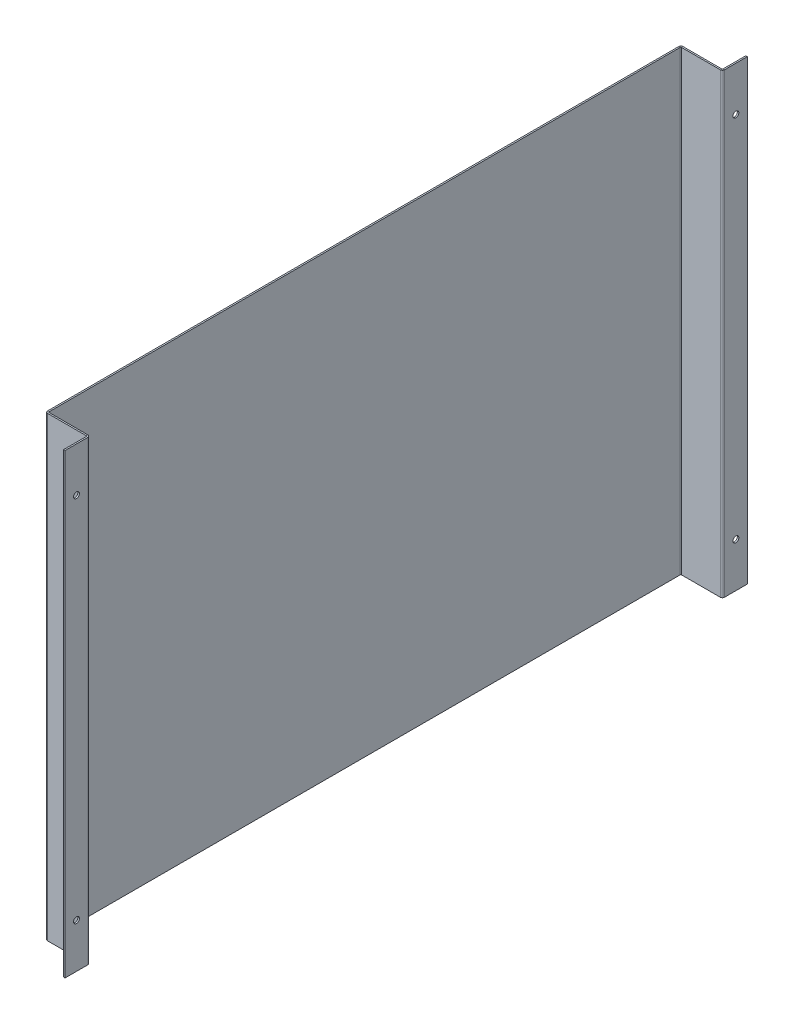
ISO-10303-21;
HEADER;
FILE_DESCRIPTION(('STEP AP214'),'2;1');
FILE_NAME('part.step','',(''),(''),'','','');
FILE_SCHEMA(('AUTOMOTIVE_DESIGN { 1 0 10303 214 1 1 1 1 }'));
ENDSEC;
DATA;
#1=APPLICATION_CONTEXT('core data for automotive mechanical design processes');
#2=APPLICATION_PROTOCOL_DEFINITION('international standard','automotive_design',2000,#1);
#3=PRODUCT_CONTEXT('',#1,'mechanical');
#4=PRODUCT('Part','Part','',(#3));
#5=PRODUCT_RELATED_PRODUCT_CATEGORY('part','',(#4));
#6=PRODUCT_DEFINITION_FORMATION('','',#4);
#7=PRODUCT_DEFINITION_CONTEXT('part definition',#1,'design');
#8=PRODUCT_DEFINITION('design','',#6,#7);
#9=PRODUCT_DEFINITION_SHAPE('','',#8);
#10=(LENGTH_UNIT() NAMED_UNIT(*) SI_UNIT(.MILLI.,.METRE.));
#11=(NAMED_UNIT(*) PLANE_ANGLE_UNIT() SI_UNIT($,.RADIAN.));
#12=(NAMED_UNIT(*) SI_UNIT($,.STERADIAN.) SOLID_ANGLE_UNIT());
#13=UNCERTAINTY_MEASURE_WITH_UNIT(LENGTH_MEASURE(1.E-05),#10,'distance_accuracy_value','');
#14=(GEOMETRIC_REPRESENTATION_CONTEXT(3) GLOBAL_UNCERTAINTY_ASSIGNED_CONTEXT((#13)) GLOBAL_UNIT_ASSIGNED_CONTEXT((#10,
#11,#12)) REPRESENTATION_CONTEXT('',''));
#15=CARTESIAN_POINT('',(0.,0.,0.));
#16=DIRECTION('',(0.,0.,1.));
#17=DIRECTION('',(1.,0.,0.));
#18=AXIS2_PLACEMENT_3D('',#15,#16,#17);
#19=CARTESIAN_POINT('',(48.2,275.,382.5));
#20=DIRECTION('',(0.,1.,0.));
#21=DIRECTION('',(0.,0.,1.));
#22=AXIS2_PLACEMENT_3D('',#19,#20,#21);
#23=PLANE('',#22);
#24=DIRECTION('',(1.,0.,0.));
#25=VECTOR('',#24,1.);
#26=CARTESIAN_POINT('',(48.2,275.,382.5));
#27=LINE('',#26,#25);
#28=CARTESIAN_POINT('',(0.736599999999967,275.,382.5));
#29=VERTEX_POINT('',#28);
#30=CARTESIAN_POINT('',(47.4634,275.,382.5));
#31=VERTEX_POINT('',#30);
#32=EDGE_CURVE('E374',#29,#31,#27,.T.);
#33=ORIENTED_EDGE('',*,*,#32,.T.);
#34=DIRECTION('',(0.,0.,-1.));
#35=VECTOR('',#34,1.);
#36=CARTESIAN_POINT('',(47.4634,275.,382.5));
#37=LINE('',#36,#35);
#38=CARTESIAN_POINT('',(47.4634,275.,380.7));
#39=VERTEX_POINT('',#38);
#40=EDGE_CURVE('E262',#31,#39,#37,.T.);
#41=ORIENTED_EDGE('',*,*,#40,.T.);
#42=DIRECTION('',(-1.,0.,0.));
#43=VECTOR('',#42,1.);
#44=CARTESIAN_POINT('',(-1.32155697174001E-12,275.,380.7));
#45=LINE('',#44,#43);
#46=CARTESIAN_POINT('',(0.736599999999974,275.,380.7));
#47=VERTEX_POINT('',#46);
#48=EDGE_CURVE('E378',#47,#39,#45,.F.);
#49=ORIENTED_EDGE('',*,*,#48,.F.);
#50=DIRECTION('',(0.,0.,1.));
#51=VECTOR('',#50,1.);
#52=CARTESIAN_POINT('',(0.736599999999976,275.,382.5));
#53=LINE('',#52,#51);
#54=EDGE_CURVE('E368',#47,#29,#53,.T.);
#55=ORIENTED_EDGE('',*,*,#54,.T.);
#56=EDGE_LOOP('',(#33,#41,#49,#55));
#57=FACE_BOUND('',#56,.T.);
#58=ADVANCED_FACE('F79',(#57),#23,.T.);
#59=CARTESIAN_POINT('',(-1.32784163814992E-12,0.,382.5));
#60=DIRECTION('',(0.,0.,1.));
#61=DIRECTION('',(1.,0.,0.));
#62=AXIS2_PLACEMENT_3D('',#59,#60,#61);
#63=PLANE('',#62);
#64=DIRECTION('',(-1.,0.,0.));
#65=VECTOR('',#64,1.);
#66=CARTESIAN_POINT('',(0.,-275.,382.5));
#67=LINE('',#66,#65);
#68=CARTESIAN_POINT('',(47.4634,-275.,382.5));
#69=VERTEX_POINT('',#68);
#70=CARTESIAN_POINT('',(0.736599999999976,-275.,382.5));
#71=VERTEX_POINT('',#70);
#72=EDGE_CURVE('E371',#69,#71,#67,.T.);
#73=ORIENTED_EDGE('',*,*,#72,.F.);
#74=DIRECTION('',(0.,1.,0.));
#75=VECTOR('',#74,1.);
#76=CARTESIAN_POINT('',(47.4634,275.,382.5));
#77=LINE('',#76,#75);
#78=EDGE_CURVE('E103',#31,#69,#77,.F.);
#79=ORIENTED_EDGE('',*,*,#78,.F.);
#80=ORIENTED_EDGE('',*,*,#32,.F.);
#81=DIRECTION('',(0.,-1.,0.));
#82=VECTOR('',#81,1.);
#83=CARTESIAN_POINT('',(0.736599999999976,0.,382.5));
#84=LINE('',#83,#82);
#85=EDGE_CURVE('E381',#29,#71,#84,.T.);
#86=ORIENTED_EDGE('',*,*,#85,.T.);
#87=EDGE_LOOP('',(#73,#79,#80,#86));
#88=FACE_BOUND('',#87,.T.);
#89=ADVANCED_FACE('F526',(#88),#63,.T.);
#90=CARTESIAN_POINT('',(-1.32155697174001E-12,0.,380.7));
#91=DIRECTION('',(0.,0.,1.));
#92=DIRECTION('',(1.,0.,0.));
#93=AXIS2_PLACEMENT_3D('',#90,#91,#92);
#94=PLANE('',#93);
#95=DIRECTION('',(0.,1.,0.));
#96=VECTOR('',#95,1.);
#97=CARTESIAN_POINT('',(47.4634,275.,380.7));
#98=LINE('',#97,#96);
#99=CARTESIAN_POINT('',(47.4634,-275.,380.7));
#100=VERTEX_POINT('',#99);
#101=EDGE_CURVE('E256',#39,#100,#98,.F.);
#102=ORIENTED_EDGE('',*,*,#101,.T.);
#103=DIRECTION('',(1.,0.,0.));
#104=VECTOR('',#103,1.);
#105=CARTESIAN_POINT('',(-1.32155697174001E-12,-275.,380.7));
#106=LINE('',#105,#104);
#107=CARTESIAN_POINT('',(0.736599999999974,-275.,380.7));
#108=VERTEX_POINT('',#107);
#109=EDGE_CURVE('E376',#100,#108,#106,.F.);
#110=ORIENTED_EDGE('',*,*,#109,.T.);
#111=DIRECTION('',(0.,1.,0.));
#112=VECTOR('',#111,1.);
#113=CARTESIAN_POINT('',(0.736599999999976,275.,380.7));
#114=LINE('',#113,#112);
#115=EDGE_CURVE('E387',#47,#108,#114,.F.);
#116=ORIENTED_EDGE('',*,*,#115,.F.);
#117=ORIENTED_EDGE('',*,*,#48,.T.);
#118=EDGE_LOOP('',(#102,#110,#116,#117));
#119=FACE_BOUND('',#118,.T.);
#120=ADVANCED_FACE('F452',(#119),#94,.F.);
#121=CARTESIAN_POINT('',(48.2,-275.,-382.5));
#122=DIRECTION('',(0.,-1.,0.));
#123=DIRECTION('',(0.,0.,-1.));
#124=AXIS2_PLACEMENT_3D('',#121,#122,#123);
#125=PLANE('',#124);
#126=DIRECTION('',(1.,0.,0.));
#127=VECTOR('',#126,1.);
#128=CARTESIAN_POINT('',(48.2,-275.,-382.5));
#129=LINE('',#128,#127);
#130=CARTESIAN_POINT('',(0.736599999999967,-275.,-382.5));
#131=VERTEX_POINT('',#130);
#132=CARTESIAN_POINT('',(47.4634,-275.,-382.5));
#133=VERTEX_POINT('',#132);
#134=EDGE_CURVE('E329',#131,#133,#129,.T.);
#135=ORIENTED_EDGE('',*,*,#134,.T.);
#136=DIRECTION('',(0.,0.,1.));
#137=VECTOR('',#136,1.);
#138=CARTESIAN_POINT('',(47.4634,-275.,-382.5));
#139=LINE('',#138,#137);
#140=CARTESIAN_POINT('',(47.4634,-275.,-380.7));
#141=VERTEX_POINT('',#140);
#142=EDGE_CURVE('E310',#133,#141,#139,.T.);
#143=ORIENTED_EDGE('',*,*,#142,.T.);
#144=DIRECTION('',(-1.,0.,0.));
#145=VECTOR('',#144,1.);
#146=CARTESIAN_POINT('',(-1.32155697174001E-12,-275.,-380.7));
#147=LINE('',#146,#145);
#148=CARTESIAN_POINT('',(0.736599999999974,-275.,-380.7));
#149=VERTEX_POINT('',#148);
#150=EDGE_CURVE('E334',#149,#141,#147,.F.);
#151=ORIENTED_EDGE('',*,*,#150,.F.);
#152=DIRECTION('',(0.,0.,-1.));
#153=VECTOR('',#152,1.);
#154=CARTESIAN_POINT('',(0.736599999999976,-275.,-382.5));
#155=LINE('',#154,#153);
#156=EDGE_CURVE('E324',#149,#131,#155,.T.);
#157=ORIENTED_EDGE('',*,*,#156,.T.);
#158=EDGE_LOOP('',(#135,#143,#151,#157));
#159=FACE_BOUND('',#158,.T.);
#160=ADVANCED_FACE('F581',(#159),#125,.T.);
#161=CARTESIAN_POINT('',(-1.32784163814992E-12,0.,-382.5));
#162=DIRECTION('',(0.,0.,-1.));
#163=DIRECTION('',(-1.,0.,0.));
#164=AXIS2_PLACEMENT_3D('',#161,#162,#163);
#165=PLANE('',#164);
#166=DIRECTION('',(-1.,0.,0.));
#167=VECTOR('',#166,1.);
#168=CARTESIAN_POINT('',(0.,275.,-382.5));
#169=LINE('',#168,#167);
#170=CARTESIAN_POINT('',(47.4634,275.,-382.5));
#171=VERTEX_POINT('',#170);
#172=CARTESIAN_POINT('',(0.736599999999976,275.,-382.5));
#173=VERTEX_POINT('',#172);
#174=EDGE_CURVE('E326',#171,#173,#169,.T.);
#175=ORIENTED_EDGE('',*,*,#174,.F.);
#176=DIRECTION('',(0.,-1.,0.));
#177=VECTOR('',#176,1.);
#178=CARTESIAN_POINT('',(47.4634,-275.,-382.5));
#179=LINE('',#178,#177);
#180=EDGE_CURVE('E316',#133,#171,#179,.F.);
#181=ORIENTED_EDGE('',*,*,#180,.F.);
#182=ORIENTED_EDGE('',*,*,#134,.F.);
#183=DIRECTION('',(0.,1.,0.));
#184=VECTOR('',#183,1.);
#185=CARTESIAN_POINT('',(0.736599999999976,0.,-382.5));
#186=LINE('',#185,#184);
#187=EDGE_CURVE('E337',#131,#173,#186,.T.);
#188=ORIENTED_EDGE('',*,*,#187,.T.);
#189=EDGE_LOOP('',(#175,#181,#182,#188));
#190=FACE_BOUND('',#189,.T.);
#191=ADVANCED_FACE('F572',(#190),#165,.T.);
#192=CARTESIAN_POINT('',(-1.32155697174001E-12,0.,-380.7));
#193=DIRECTION('',(0.,0.,-1.));
#194=DIRECTION('',(-1.,0.,0.));
#195=AXIS2_PLACEMENT_3D('',#192,#193,#194);
#196=PLANE('',#195);
#197=DIRECTION('',(0.,-1.,0.));
#198=VECTOR('',#197,1.);
#199=CARTESIAN_POINT('',(47.4634,-275.,-380.7));
#200=LINE('',#199,#198);
#201=CARTESIAN_POINT('',(47.4634,275.,-380.7));
#202=VERTEX_POINT('',#201);
#203=EDGE_CURVE('E304',#141,#202,#200,.F.);
#204=ORIENTED_EDGE('',*,*,#203,.T.);
#205=DIRECTION('',(1.,0.,0.));
#206=VECTOR('',#205,1.);
#207=CARTESIAN_POINT('',(-1.32155697174001E-12,275.,-380.7));
#208=LINE('',#207,#206);
#209=CARTESIAN_POINT('',(0.736599999999974,275.,-380.7));
#210=VERTEX_POINT('',#209);
#211=EDGE_CURVE('E332',#202,#210,#208,.F.);
#212=ORIENTED_EDGE('',*,*,#211,.T.);
#213=DIRECTION('',(0.,-1.,0.));
#214=VECTOR('',#213,1.);
#215=CARTESIAN_POINT('',(0.736599999999976,-275.,-380.7));
#216=LINE('',#215,#214);
#217=EDGE_CURVE('E343',#149,#210,#216,.F.);
#218=ORIENTED_EDGE('',*,*,#217,.F.);
#219=ORIENTED_EDGE('',*,*,#150,.T.);
#220=EDGE_LOOP('',(#204,#212,#218,#219));
#221=FACE_BOUND('',#220,.T.);
#222=ADVANCED_FACE('F550',(#221),#196,.F.);
#223=CARTESIAN_POINT('',(-1.8,0.,0.));
#224=DIRECTION('',(-1.,0.,0.));
#225=DIRECTION('',(0.,0.,1.));
#226=AXIS2_PLACEMENT_3D('',#223,#224,#225);
#227=PLANE('',#226);
#228=DIRECTION('',(0.,0.,1.));
#229=VECTOR('',#228,1.);
#230=CARTESIAN_POINT('',(-1.8,275.,382.5));
#231=LINE('',#230,#229);
#232=CARTESIAN_POINT('',(-1.8,275.,-379.9634));
#233=VERTEX_POINT('',#232);
#234=CARTESIAN_POINT('',(-1.8,275.,379.9634));
#235=VERTEX_POINT('',#234);
#236=EDGE_CURVE('E88',#233,#235,#231,.T.);
#237=ORIENTED_EDGE('',*,*,#236,.F.);
#238=DIRECTION('',(0.,1.,0.));
#239=VECTOR('',#238,1.);
#240=CARTESIAN_POINT('',(-1.8,275.,-379.9634));
#241=LINE('',#240,#239);
#242=CARTESIAN_POINT('',(-1.8,-275.,-379.9634));
#243=VERTEX_POINT('',#242);
#244=EDGE_CURVE('E348',#233,#243,#241,.F.);
#245=ORIENTED_EDGE('',*,*,#244,.T.);
#246=DIRECTION('',(0.,0.,-1.));
#247=VECTOR('',#246,1.);
#248=CARTESIAN_POINT('',(-1.8,-275.,382.5));
#249=LINE('',#248,#247);
#250=CARTESIAN_POINT('',(-1.8,-275.,379.9634));
#251=VERTEX_POINT('',#250);
#252=EDGE_CURVE('E13',#251,#243,#249,.T.);
#253=ORIENTED_EDGE('',*,*,#252,.F.);
#254=DIRECTION('',(0.,-1.,0.));
#255=VECTOR('',#254,1.);
#256=CARTESIAN_POINT('',(-1.8,-275.,379.9634));
#257=LINE('',#256,#255);
#258=EDGE_CURVE('E392',#251,#235,#257,.F.);
#259=ORIENTED_EDGE('',*,*,#258,.T.);
#260=EDGE_LOOP('',(#237,#245,#253,#259));
#261=FACE_BOUND('',#260,.T.);
#262=ADVANCED_FACE('F434',(#261),#227,.T.);
#263=CARTESIAN_POINT('',(0.,0.,0.));
#264=DIRECTION('',(-1.,0.,0.));
#265=DIRECTION('',(0.,0.,1.));
#266=AXIS2_PLACEMENT_3D('',#263,#264,#265);
#267=PLANE('',#266);
#268=DIRECTION('',(0.,1.,0.));
#269=VECTOR('',#268,1.);
#270=CARTESIAN_POINT('',(0.,275.,-379.9634));
#271=LINE('',#270,#269);
#272=CARTESIAN_POINT('',(0.,275.,-379.9634));
#273=VERTEX_POINT('',#272);
#274=CARTESIAN_POINT('',(0.,-275.,-379.9634));
#275=VERTEX_POINT('',#274);
#276=EDGE_CURVE('E361',#273,#275,#271,.F.);
#277=ORIENTED_EDGE('',*,*,#276,.F.);
#278=DIRECTION('',(0.,0.,1.));
#279=VECTOR('',#278,1.);
#280=CARTESIAN_POINT('',(0.,275.,382.5));
#281=LINE('',#280,#279);
#282=CARTESIAN_POINT('',(0.,275.,379.9634));
#283=VERTEX_POINT('',#282);
#284=EDGE_CURVE('E412',#273,#283,#281,.T.);
#285=ORIENTED_EDGE('',*,*,#284,.T.);
#286=DIRECTION('',(0.,-1.,0.));
#287=VECTOR('',#286,1.);
#288=CARTESIAN_POINT('',(0.,-275.,379.9634));
#289=LINE('',#288,#287);
#290=CARTESIAN_POINT('',(0.,-275.,379.9634));
#291=VERTEX_POINT('',#290);
#292=EDGE_CURVE('E405',#291,#283,#289,.F.);
#293=ORIENTED_EDGE('',*,*,#292,.F.);
#294=DIRECTION('',(0.,0.,-1.));
#295=VECTOR('',#294,1.);
#296=CARTESIAN_POINT('',(0.,-275.,382.5));
#297=LINE('',#296,#295);
#298=EDGE_CURVE('E83',#291,#275,#297,.T.);
#299=ORIENTED_EDGE('',*,*,#298,.T.);
#300=EDGE_LOOP('',(#277,#285,#293,#299));
#301=FACE_BOUND('',#300,.T.);
#302=ADVANCED_FACE('F424',(#301),#267,.F.);
#303=CARTESIAN_POINT('',(-1.8,275.,382.5));
#304=DIRECTION('',(0.,1.,0.));
#305=DIRECTION('',(0.,0.,1.));
#306=AXIS2_PLACEMENT_3D('',#303,#304,#305);
#307=PLANE('',#306);
#308=ORIENTED_EDGE('',*,*,#284,.F.);
#309=DIRECTION('',(-1.,0.,0.));
#310=VECTOR('',#309,1.);
#311=CARTESIAN_POINT('',(0.,275.,-379.9634));
#312=LINE('',#311,#310);
#313=EDGE_CURVE('E355',#273,#233,#312,.T.);
#314=ORIENTED_EDGE('',*,*,#313,.T.);
#315=ORIENTED_EDGE('',*,*,#236,.T.);
#316=DIRECTION('',(-1.,0.,0.));
#317=VECTOR('',#316,1.);
#318=CARTESIAN_POINT('',(0.,275.,379.9634));
#319=LINE('',#318,#317);
#320=EDGE_CURVE('E409',#283,#235,#319,.T.);
#321=ORIENTED_EDGE('',*,*,#320,.F.);
#322=EDGE_LOOP('',(#308,#314,#315,#321));
#323=FACE_BOUND('',#322,.T.);
#324=ADVANCED_FACE('F81',(#323),#307,.T.);
#325=CARTESIAN_POINT('',(-1.8,-275.,382.5));
#326=DIRECTION('',(0.,-1.,0.));
#327=DIRECTION('',(0.,0.,-1.));
#328=AXIS2_PLACEMENT_3D('',#325,#326,#327);
#329=PLANE('',#328);
#330=DIRECTION('',(-1.,0.,0.));
#331=VECTOR('',#330,1.);
#332=CARTESIAN_POINT('',(0.,-275.,-379.9634));
#333=LINE('',#332,#331);
#334=EDGE_CURVE('E365',#275,#243,#333,.T.);
#335=ORIENTED_EDGE('',*,*,#334,.F.);
#336=ORIENTED_EDGE('',*,*,#298,.F.);
#337=DIRECTION('',(-1.,0.,0.));
#338=VECTOR('',#337,1.);
#339=CARTESIAN_POINT('',(0.,-275.,379.9634));
#340=LINE('',#339,#338);
#341=EDGE_CURVE('E399',#291,#251,#340,.T.);
#342=ORIENTED_EDGE('',*,*,#341,.T.);
#343=ORIENTED_EDGE('',*,*,#252,.T.);
#344=EDGE_LOOP('',(#335,#336,#342,#343));
#345=FACE_BOUND('',#344,.T.);
#346=ADVANCED_FACE('F427',(#345),#329,.T.);
#347=CARTESIAN_POINT('',(0.736599999999976,275.,379.9634));
#348=DIRECTION('',(0.,1.,0.));
#349=DIRECTION('',(0.,0.,1.));
#350=AXIS2_PLACEMENT_3D('',#347,#348,#349);
#351=PLANE('',#350);
#352=ORIENTED_EDGE('',*,*,#54,.F.);
#353=CARTESIAN_POINT('',(0.736599999999976,275.,379.9634));
#354=DIRECTION('',(0.,-1.,0.));
#355=DIRECTION('',(0.,0.,-1.));
#356=AXIS2_PLACEMENT_3D('',#353,#354,#355);
#357=CIRCLE('',#356,0.736599999999976);
#358=EDGE_CURVE('E402',#283,#47,#357,.F.);
#359=ORIENTED_EDGE('',*,*,#358,.F.);
#360=ORIENTED_EDGE('',*,*,#320,.T.);
#361=CARTESIAN_POINT('',(0.736599999999976,275.,379.9634));
#362=DIRECTION('',(0.,-1.,0.));
#363=DIRECTION('',(0.,0.,-1.));
#364=AXIS2_PLACEMENT_3D('',#361,#362,#363);
#365=CIRCLE('',#364,2.53659999999998);
#366=EDGE_CURVE('E395',#235,#29,#365,.F.);
#367=ORIENTED_EDGE('',*,*,#366,.T.);
#368=EDGE_LOOP('',(#352,#359,#360,#367));
#369=FACE_BOUND('',#368,.T.);
#370=ADVANCED_FACE('F445',(#369),#351,.T.);
#371=CARTESIAN_POINT('',(0.736599999999976,-275.,379.9634));
#372=DIRECTION('',(0.,1.,0.));
#373=DIRECTION('',(0.,0.,1.));
#374=AXIS2_PLACEMENT_3D('',#371,#372,#373);
#375=PLANE('',#374);
#376=CARTESIAN_POINT('',(0.736599999999976,-275.,379.9634));
#377=DIRECTION('',(0.,-1.,0.));
#378=DIRECTION('',(0.,0.,-1.));
#379=AXIS2_PLACEMENT_3D('',#376,#377,#378);
#380=CIRCLE('',#379,0.736599999999976);
#381=EDGE_CURVE('E373',#108,#291,#380,.T.);
#382=ORIENTED_EDGE('',*,*,#381,.F.);
#383=DIRECTION('',(0.,0.,1.));
#384=VECTOR('',#383,1.);
#385=CARTESIAN_POINT('',(0.736599999999976,-275.,380.7));
#386=LINE('',#385,#384);
#387=EDGE_CURVE('E384',#108,#71,#386,.T.);
#388=ORIENTED_EDGE('',*,*,#387,.T.);
#389=CARTESIAN_POINT('',(0.736599999999976,-275.,379.9634));
#390=DIRECTION('',(0.,-1.,0.));
#391=DIRECTION('',(0.,0.,-1.));
#392=AXIS2_PLACEMENT_3D('',#389,#390,#391);
#393=CIRCLE('',#392,2.53659999999998);
#394=EDGE_CURVE('E396',#71,#251,#393,.T.);
#395=ORIENTED_EDGE('',*,*,#394,.T.);
#396=ORIENTED_EDGE('',*,*,#341,.F.);
#397=EDGE_LOOP('',(#382,#388,#395,#396));
#398=FACE_BOUND('',#397,.T.);
#399=ADVANCED_FACE('F539',(#398),#375,.F.);
#400=CARTESIAN_POINT('',(0.736599999999976,-275.,379.9634));
#401=DIRECTION('',(0.,-1.,0.));
#402=DIRECTION('',(0.,0.,1.));
#403=AXIS2_PLACEMENT_3D('',#400,#401,#402);
#404=CYLINDRICAL_SURFACE('',#403,2.53659999999998);
#405=ORIENTED_EDGE('',*,*,#258,.F.);
#406=ORIENTED_EDGE('',*,*,#394,.F.);
#407=ORIENTED_EDGE('',*,*,#85,.F.);
#408=ORIENTED_EDGE('',*,*,#366,.F.);
#409=EDGE_LOOP('',(#405,#406,#407,#408));
#410=FACE_BOUND('',#409,.T.);
#411=ADVANCED_FACE('F536',(#410),#404,.T.);
#412=CARTESIAN_POINT('',(0.736599999999976,-275.,379.9634));
#413=DIRECTION('',(0.,-1.,0.));
#414=DIRECTION('',(0.,0.,1.));
#415=AXIS2_PLACEMENT_3D('',#412,#413,#414);
#416=CYLINDRICAL_SURFACE('',#415,0.736599999999976);
#417=ORIENTED_EDGE('',*,*,#292,.T.);
#418=ORIENTED_EDGE('',*,*,#358,.T.);
#419=ORIENTED_EDGE('',*,*,#115,.T.);
#420=ORIENTED_EDGE('',*,*,#381,.T.);
#421=EDGE_LOOP('',(#417,#418,#419,#420));
#422=FACE_BOUND('',#421,.T.);
#423=ADVANCED_FACE('F448',(#422),#416,.F.);
#424=CARTESIAN_POINT('',(0.,-275.,382.5));
#425=DIRECTION('',(0.,-1.,0.));
#426=DIRECTION('',(0.,0.,-1.));
#427=AXIS2_PLACEMENT_3D('',#424,#425,#426);
#428=PLANE('',#427);
#429=DIRECTION('',(0.,0.,-1.));
#430=VECTOR('',#429,1.);
#431=CARTESIAN_POINT('',(47.4634,-275.,382.5));
#432=LINE('',#431,#430);
#433=EDGE_CURVE('E96',#69,#100,#432,.T.);
#434=ORIENTED_EDGE('',*,*,#433,.F.);
#435=ORIENTED_EDGE('',*,*,#72,.T.);
#436=ORIENTED_EDGE('',*,*,#387,.F.);
#437=ORIENTED_EDGE('',*,*,#109,.F.);
#438=EDGE_LOOP('',(#434,#435,#436,#437));
#439=FACE_BOUND('',#438,.T.);
#440=ADVANCED_FACE('F534',(#439),#428,.T.);
#441=CARTESIAN_POINT('',(0.736599999999976,-275.,-379.9634));
#442=DIRECTION('',(0.,-1.,0.));
#443=DIRECTION('',(0.,0.,-1.));
#444=AXIS2_PLACEMENT_3D('',#441,#442,#443);
#445=PLANE('',#444);
#446=ORIENTED_EDGE('',*,*,#156,.F.);
#447=CARTESIAN_POINT('',(0.736599999999976,-275.,-379.9634));
#448=DIRECTION('',(0.,1.,0.));
#449=DIRECTION('',(0.,0.,1.));
#450=AXIS2_PLACEMENT_3D('',#447,#448,#449);
#451=CIRCLE('',#450,0.736599999999976);
#452=EDGE_CURVE('E358',#275,#149,#451,.F.);
#453=ORIENTED_EDGE('',*,*,#452,.F.);
#454=ORIENTED_EDGE('',*,*,#334,.T.);
#455=CARTESIAN_POINT('',(0.736599999999976,-275.,-379.9634));
#456=DIRECTION('',(0.,1.,0.));
#457=DIRECTION('',(0.,0.,1.));
#458=AXIS2_PLACEMENT_3D('',#455,#456,#457);
#459=CIRCLE('',#458,2.53659999999998);
#460=EDGE_CURVE('E351',#243,#131,#459,.F.);
#461=ORIENTED_EDGE('',*,*,#460,.T.);
#462=EDGE_LOOP('',(#446,#453,#454,#461));
#463=FACE_BOUND('',#462,.T.);
#464=ADVANCED_FACE('F431',(#463),#445,.T.);
#465=CARTESIAN_POINT('',(0.736599999999976,275.,-379.9634));
#466=DIRECTION('',(0.,-1.,0.));
#467=DIRECTION('',(0.,0.,-1.));
#468=AXIS2_PLACEMENT_3D('',#465,#466,#467);
#469=PLANE('',#468);
#470=CARTESIAN_POINT('',(0.736599999999976,275.,-379.9634));
#471=DIRECTION('',(0.,1.,0.));
#472=DIRECTION('',(0.,0.,1.));
#473=AXIS2_PLACEMENT_3D('',#470,#471,#472);
#474=CIRCLE('',#473,0.736599999999976);
#475=EDGE_CURVE('E328',#210,#273,#474,.T.);
#476=ORIENTED_EDGE('',*,*,#475,.F.);
#477=DIRECTION('',(0.,0.,-1.));
#478=VECTOR('',#477,1.);
#479=CARTESIAN_POINT('',(0.736599999999976,275.,-380.7));
#480=LINE('',#479,#478);
#481=EDGE_CURVE('E340',#210,#173,#480,.T.);
#482=ORIENTED_EDGE('',*,*,#481,.T.);
#483=CARTESIAN_POINT('',(0.736599999999976,275.,-379.9634));
#484=DIRECTION('',(0.,1.,0.));
#485=DIRECTION('',(0.,0.,1.));
#486=AXIS2_PLACEMENT_3D('',#483,#484,#485);
#487=CIRCLE('',#486,2.53659999999998);
#488=EDGE_CURVE('E352',#173,#233,#487,.T.);
#489=ORIENTED_EDGE('',*,*,#488,.T.);
#490=ORIENTED_EDGE('',*,*,#313,.F.);
#491=EDGE_LOOP('',(#476,#482,#489,#490));
#492=FACE_BOUND('',#491,.T.);
#493=ADVANCED_FACE('F440',(#492),#469,.F.);
#494=CARTESIAN_POINT('',(0.736599999999976,275.,-379.9634));
#495=DIRECTION('',(0.,1.,0.));
#496=DIRECTION('',(0.,0.,-1.));
#497=AXIS2_PLACEMENT_3D('',#494,#495,#496);
#498=CYLINDRICAL_SURFACE('',#497,2.53659999999998);
#499=ORIENTED_EDGE('',*,*,#244,.F.);
#500=ORIENTED_EDGE('',*,*,#488,.F.);
#501=ORIENTED_EDGE('',*,*,#187,.F.);
#502=ORIENTED_EDGE('',*,*,#460,.F.);
#503=EDGE_LOOP('',(#499,#500,#501,#502));
#504=FACE_BOUND('',#503,.T.);
#505=ADVANCED_FACE('F437',(#504),#498,.T.);
#506=CARTESIAN_POINT('',(0.736599999999976,275.,-379.9634));
#507=DIRECTION('',(0.,1.,0.));
#508=DIRECTION('',(0.,0.,-1.));
#509=AXIS2_PLACEMENT_3D('',#506,#507,#508);
#510=CYLINDRICAL_SURFACE('',#509,0.736599999999976);
#511=ORIENTED_EDGE('',*,*,#276,.T.);
#512=ORIENTED_EDGE('',*,*,#452,.T.);
#513=ORIENTED_EDGE('',*,*,#217,.T.);
#514=ORIENTED_EDGE('',*,*,#475,.T.);
#515=EDGE_LOOP('',(#511,#512,#513,#514));
#516=FACE_BOUND('',#515,.T.);
#517=ADVANCED_FACE('F609',(#516),#510,.F.);
#518=CARTESIAN_POINT('',(0.,275.,-382.5));
#519=DIRECTION('',(0.,1.,0.));
#520=DIRECTION('',(0.,0.,1.));
#521=AXIS2_PLACEMENT_3D('',#518,#519,#520);
#522=PLANE('',#521);
#523=DIRECTION('',(0.,0.,1.));
#524=VECTOR('',#523,1.);
#525=CARTESIAN_POINT('',(47.4634,275.,-382.5));
#526=LINE('',#525,#524);
#527=EDGE_CURVE('E321',#171,#202,#526,.T.);
#528=ORIENTED_EDGE('',*,*,#527,.F.);
#529=ORIENTED_EDGE('',*,*,#174,.T.);
#530=ORIENTED_EDGE('',*,*,#481,.F.);
#531=ORIENTED_EDGE('',*,*,#211,.F.);
#532=EDGE_LOOP('',(#528,#529,#530,#531));
#533=FACE_BOUND('',#532,.T.);
#534=ADVANCED_FACE('F614',(#533),#522,.T.);
#535=CARTESIAN_POINT('',(47.4634,275.,-383.2366));
#536=DIRECTION('',(0.,1.,0.));
#537=DIRECTION('',(0.,0.,1.));
#538=AXIS2_PLACEMENT_3D('',#535,#536,#537);
#539=PLANE('',#538);
#540=DIRECTION('',(1.,0.,0.));
#541=VECTOR('',#540,1.);
#542=CARTESIAN_POINT('',(48.2,275.,-383.2366));
#543=LINE('',#542,#541);
#544=CARTESIAN_POINT('',(48.2,275.,-383.2366));
#545=VERTEX_POINT('',#544);
#546=CARTESIAN_POINT('',(50.,275.,-383.2366));
#547=VERTEX_POINT('',#546);
#548=EDGE_CURVE('E272',#545,#547,#543,.T.);
#549=ORIENTED_EDGE('',*,*,#548,.F.);
#550=CARTESIAN_POINT('',(47.4634,275.,-383.2366));
#551=DIRECTION('',(0.,-1.,0.));
#552=DIRECTION('',(0.,0.,-1.));
#553=AXIS2_PLACEMENT_3D('',#550,#551,#552);
#554=CIRCLE('',#553,0.736599999999983);
#555=EDGE_CURVE('E313',#171,#545,#554,.F.);
#556=ORIENTED_EDGE('',*,*,#555,.F.);
#557=ORIENTED_EDGE('',*,*,#527,.T.);
#558=CARTESIAN_POINT('',(47.4634,275.,-383.2366));
#559=DIRECTION('',(0.,-1.,0.));
#560=DIRECTION('',(0.,0.,-1.));
#561=AXIS2_PLACEMENT_3D('',#558,#559,#560);
#562=CIRCLE('',#561,2.53659999999998);
#563=EDGE_CURVE('E306',#202,#547,#562,.F.);
#564=ORIENTED_EDGE('',*,*,#563,.T.);
#565=EDGE_LOOP('',(#549,#556,#557,#564));
#566=FACE_BOUND('',#565,.T.);
#567=ADVANCED_FACE('F711',(#566),#539,.T.);
#568=CARTESIAN_POINT('',(47.4634,-275.,-383.2366));
#569=DIRECTION('',(0.,1.,0.));
#570=DIRECTION('',(0.,0.,1.));
#571=AXIS2_PLACEMENT_3D('',#568,#569,#570);
#572=PLANE('',#571);
#573=CARTESIAN_POINT('',(47.4634,-275.,-383.2366));
#574=DIRECTION('',(0.,-1.,0.));
#575=DIRECTION('',(0.,0.,-1.));
#576=AXIS2_PLACEMENT_3D('',#573,#574,#575);
#577=CIRCLE('',#576,0.736599999999983);
#578=CARTESIAN_POINT('',(48.2,-275.,-383.2366));
#579=VERTEX_POINT('',#578);
#580=EDGE_CURVE('E303',#579,#133,#577,.T.);
#581=ORIENTED_EDGE('',*,*,#580,.F.);
#582=DIRECTION('',(1.,0.,0.));
#583=VECTOR('',#582,1.);
#584=CARTESIAN_POINT('',(48.2,-275.,-383.2366));
#585=LINE('',#584,#583);
#586=CARTESIAN_POINT('',(50.,-275.,-383.2366));
#587=VERTEX_POINT('',#586);
#588=EDGE_CURVE('E276',#579,#587,#585,.T.);
#589=ORIENTED_EDGE('',*,*,#588,.T.);
#590=CARTESIAN_POINT('',(47.4634,-275.,-383.2366));
#591=DIRECTION('',(0.,-1.,0.));
#592=DIRECTION('',(0.,0.,-1.));
#593=AXIS2_PLACEMENT_3D('',#590,#591,#592);
#594=CIRCLE('',#593,2.53659999999998);
#595=EDGE_CURVE('E307',#587,#141,#594,.T.);
#596=ORIENTED_EDGE('',*,*,#595,.T.);
#597=ORIENTED_EDGE('',*,*,#142,.F.);
#598=EDGE_LOOP('',(#581,#589,#596,#597));
#599=FACE_BOUND('',#598,.T.);
#600=ADVANCED_FACE('F743',(#599),#572,.F.);
#601=CARTESIAN_POINT('',(47.4634,-275.,-383.2366));
#602=DIRECTION('',(0.,-1.,0.));
#603=DIRECTION('',(1.,0.,0.));
#604=AXIS2_PLACEMENT_3D('',#601,#602,#603);
#605=CYLINDRICAL_SURFACE('',#604,2.53659999999998);
#606=ORIENTED_EDGE('',*,*,#203,.F.);
#607=ORIENTED_EDGE('',*,*,#595,.F.);
#608=DIRECTION('',(0.,1.,0.));
#609=VECTOR('',#608,1.);
#610=CARTESIAN_POINT('',(50.,0.,-383.2366));
#611=LINE('',#610,#609);
#612=EDGE_CURVE('E279',#587,#547,#611,.T.);
#613=ORIENTED_EDGE('',*,*,#612,.T.);
#614=ORIENTED_EDGE('',*,*,#563,.F.);
#615=EDGE_LOOP('',(#606,#607,#613,#614));
#616=FACE_BOUND('',#615,.T.);
#617=ADVANCED_FACE('F754',(#616),#605,.T.);
#618=CARTESIAN_POINT('',(47.4634,-275.,-383.2366));
#619=DIRECTION('',(0.,-1.,0.));
#620=DIRECTION('',(1.,0.,0.));
#621=AXIS2_PLACEMENT_3D('',#618,#619,#620);
#622=CYLINDRICAL_SURFACE('',#621,0.736599999999983);
#623=ORIENTED_EDGE('',*,*,#180,.T.);
#624=ORIENTED_EDGE('',*,*,#555,.T.);
#625=DIRECTION('',(0.,-1.,0.));
#626=VECTOR('',#625,1.);
#627=CARTESIAN_POINT('',(48.2,275.,-383.2366));
#628=LINE('',#627,#626);
#629=EDGE_CURVE('E274',#545,#579,#628,.T.);
#630=ORIENTED_EDGE('',*,*,#629,.T.);
#631=ORIENTED_EDGE('',*,*,#580,.T.);
#632=EDGE_LOOP('',(#623,#624,#630,#631));
#633=FACE_BOUND('',#632,.T.);
#634=ADVANCED_FACE('F765',(#633),#622,.F.);
#635=CARTESIAN_POINT('',(50.,-275.,-410.7));
#636=DIRECTION('',(0.,1.,0.));
#637=DIRECTION('',(0.,0.,1.));
#638=AXIS2_PLACEMENT_3D('',#635,#636,#637);
#639=PLANE('',#638);
#640=ORIENTED_EDGE('',*,*,#588,.F.);
#641=DIRECTION('',(0.,0.,-1.));
#642=VECTOR('',#641,1.);
#643=CARTESIAN_POINT('',(48.2,-275.,-410.7));
#644=LINE('',#643,#642);
#645=CARTESIAN_POINT('',(48.2,-275.,-410.7));
#646=VERTEX_POINT('',#645);
#647=EDGE_CURVE('E283',#579,#646,#644,.T.);
#648=ORIENTED_EDGE('',*,*,#647,.T.);
#649=DIRECTION('',(-1.,0.,0.));
#650=VECTOR('',#649,1.);
#651=CARTESIAN_POINT('',(50.,-275.,-410.7));
#652=LINE('',#651,#650);
#653=CARTESIAN_POINT('',(50.,-275.,-410.7));
#654=VERTEX_POINT('',#653);
#655=EDGE_CURVE('E300',#654,#646,#652,.T.);
#656=ORIENTED_EDGE('',*,*,#655,.F.);
#657=DIRECTION('',(0.,0.,-1.));
#658=VECTOR('',#657,1.);
#659=CARTESIAN_POINT('',(50.,-275.,-410.7));
#660=LINE('',#659,#658);
#661=EDGE_CURVE('E284',#587,#654,#660,.T.);
#662=ORIENTED_EDGE('',*,*,#661,.F.);
#663=EDGE_LOOP('',(#640,#648,#656,#662));
#664=FACE_BOUND('',#663,.T.);
#665=ADVANCED_FACE('F776',(#664),#639,.F.);
#666=CARTESIAN_POINT('',(50.,275.,-382.5));
#667=DIRECTION('',(0.,-1.,0.));
#668=DIRECTION('',(0.,0.,-1.));
#669=AXIS2_PLACEMENT_3D('',#666,#667,#668);
#670=PLANE('',#669);
#671=ORIENTED_EDGE('',*,*,#548,.T.);
#672=DIRECTION('',(0.,0.,1.));
#673=VECTOR('',#672,1.);
#674=CARTESIAN_POINT('',(50.,275.,-382.5));
#675=LINE('',#674,#673);
#676=CARTESIAN_POINT('',(50.,275.,-410.7));
#677=VERTEX_POINT('',#676);
#678=EDGE_CURVE('E289',#677,#547,#675,.T.);
#679=ORIENTED_EDGE('',*,*,#678,.F.);
#680=DIRECTION('',(-1.,0.,0.));
#681=VECTOR('',#680,1.);
#682=CARTESIAN_POINT('',(50.,275.,-410.7));
#683=LINE('',#682,#681);
#684=CARTESIAN_POINT('',(48.2,275.,-410.7));
#685=VERTEX_POINT('',#684);
#686=EDGE_CURVE('E292',#677,#685,#683,.T.);
#687=ORIENTED_EDGE('',*,*,#686,.T.);
#688=DIRECTION('',(0.,0.,1.));
#689=VECTOR('',#688,1.);
#690=CARTESIAN_POINT('',(48.2,275.,-382.5));
#691=LINE('',#690,#689);
#692=EDGE_CURVE('E287',#685,#545,#691,.T.);
#693=ORIENTED_EDGE('',*,*,#692,.T.);
#694=EDGE_LOOP('',(#671,#679,#687,#693));
#695=FACE_BOUND('',#694,.T.);
#696=ADVANCED_FACE('F787',(#695),#670,.F.);
#697=CARTESIAN_POINT('',(50.,0.,0.));
#698=DIRECTION('',(-1.,0.,0.));
#699=DIRECTION('',(0.,0.,1.));
#700=AXIS2_PLACEMENT_3D('',#697,#698,#699);
#701=PLANE('',#700);
#702=CARTESIAN_POINT('',(50.,-221.5,-396.9683));
#703=DIRECTION('',(-1.,0.,0.));
#704=DIRECTION('',(0.,0.,1.));
#705=AXIS2_PLACEMENT_3D('',#702,#703,#704);
#706=CIRCLE('',#705,3.50000000000002);
#707=CARTESIAN_POINT('',(50.,-221.5,-393.4683));
#708=VERTEX_POINT('',#707);
#709=EDGE_CURVE('E478',#708,#708,#706,.T.);
#710=ORIENTED_EDGE('',*,*,#709,.T.);
#711=EDGE_LOOP('',(#710));
#712=FACE_BOUND('',#711,.T.);
#713=CARTESIAN_POINT('',(50.,221.5,-396.9683));
#714=DIRECTION('',(-1.,0.,0.));
#715=DIRECTION('',(0.,0.,1.));
#716=AXIS2_PLACEMENT_3D('',#713,#714,#715);
#717=CIRCLE('',#716,3.50000000000002);
#718=CARTESIAN_POINT('',(50.,221.5,-393.4683));
#719=VERTEX_POINT('',#718);
#720=EDGE_CURVE('E472',#719,#719,#717,.T.);
#721=ORIENTED_EDGE('',*,*,#720,.T.);
#722=EDGE_LOOP('',(#721));
#723=FACE_BOUND('',#722,.T.);
#724=ORIENTED_EDGE('',*,*,#612,.F.);
#725=ORIENTED_EDGE('',*,*,#661,.T.);
#726=DIRECTION('',(0.,1.,0.));
#727=VECTOR('',#726,1.);
#728=CARTESIAN_POINT('',(50.,275.,-410.7));
#729=LINE('',#728,#727);
#730=EDGE_CURVE('E286',#654,#677,#729,.T.);
#731=ORIENTED_EDGE('',*,*,#730,.T.);
#732=ORIENTED_EDGE('',*,*,#678,.T.);
#733=EDGE_LOOP('',(#724,#725,#731,#732));
#734=FACE_BOUND('',#733,.T.);
#735=ADVANCED_FACE('F798',(#712,#723,#734),#701,.F.);
#736=CARTESIAN_POINT('',(48.2,0.,0.));
#737=DIRECTION('',(-1.,0.,0.));
#738=DIRECTION('',(0.,0.,1.));
#739=AXIS2_PLACEMENT_3D('',#736,#737,#738);
#740=PLANE('',#739);
#741=CARTESIAN_POINT('',(48.2,-221.5,-396.9683));
#742=DIRECTION('',(-1.,0.,0.));
#743=DIRECTION('',(0.,0.,1.));
#744=AXIS2_PLACEMENT_3D('',#741,#742,#743);
#745=CIRCLE('',#744,3.50000000000002);
#746=CARTESIAN_POINT('',(48.2,-221.5,-393.4683));
#747=VERTEX_POINT('',#746);
#748=EDGE_CURVE('E481',#747,#747,#745,.T.);
#749=ORIENTED_EDGE('',*,*,#748,.F.);
#750=EDGE_LOOP('',(#749));
#751=FACE_BOUND('',#750,.T.);
#752=CARTESIAN_POINT('',(48.2,221.5,-396.9683));
#753=DIRECTION('',(-1.,0.,0.));
#754=DIRECTION('',(0.,0.,1.));
#755=AXIS2_PLACEMENT_3D('',#752,#753,#754);
#756=CIRCLE('',#755,3.50000000000002);
#757=CARTESIAN_POINT('',(48.2,221.5,-393.4683));
#758=VERTEX_POINT('',#757);
#759=EDGE_CURVE('E475',#758,#758,#756,.T.);
#760=ORIENTED_EDGE('',*,*,#759,.F.);
#761=EDGE_LOOP('',(#760));
#762=FACE_BOUND('',#761,.T.);
#763=ORIENTED_EDGE('',*,*,#647,.F.);
#764=ORIENTED_EDGE('',*,*,#629,.F.);
#765=ORIENTED_EDGE('',*,*,#692,.F.);
#766=DIRECTION('',(0.,1.,0.));
#767=VECTOR('',#766,1.);
#768=CARTESIAN_POINT('',(48.2,275.,-410.7));
#769=LINE('',#768,#767);
#770=EDGE_CURVE('E294',#646,#685,#769,.T.);
#771=ORIENTED_EDGE('',*,*,#770,.F.);
#772=EDGE_LOOP('',(#763,#764,#765,#771));
#773=FACE_BOUND('',#772,.T.);
#774=ADVANCED_FACE('F810',(#751,#762,#773),#740,.T.);
#775=CARTESIAN_POINT('',(50.,275.,-410.7));
#776=DIRECTION('',(0.,0.,1.));
#777=DIRECTION('',(1.,0.,0.));
#778=AXIS2_PLACEMENT_3D('',#775,#776,#777);
#779=PLANE('',#778);
#780=ORIENTED_EDGE('',*,*,#770,.T.);
#781=ORIENTED_EDGE('',*,*,#686,.F.);
#782=ORIENTED_EDGE('',*,*,#730,.F.);
#783=ORIENTED_EDGE('',*,*,#655,.T.);
#784=EDGE_LOOP('',(#780,#781,#782,#783));
#785=FACE_BOUND('',#784,.T.);
#786=ADVANCED_FACE('F822',(#785),#779,.F.);
#787=CARTESIAN_POINT('',(47.4634,-275.,383.2366));
#788=DIRECTION('',(0.,-1.,0.));
#789=DIRECTION('',(0.,0.,-1.));
#790=AXIS2_PLACEMENT_3D('',#787,#788,#789);
#791=PLANE('',#790);
#792=DIRECTION('',(1.,0.,0.));
#793=VECTOR('',#792,1.);
#794=CARTESIAN_POINT('',(48.2,-275.,383.2366));
#795=LINE('',#794,#793);
#796=CARTESIAN_POINT('',(48.2,-275.,383.2366));
#797=VERTEX_POINT('',#796);
#798=CARTESIAN_POINT('',(50.,-275.,383.2366));
#799=VERTEX_POINT('',#798);
#800=EDGE_CURVE('E468',#797,#799,#795,.T.);
#801=ORIENTED_EDGE('',*,*,#800,.F.);
#802=CARTESIAN_POINT('',(47.4634,-275.,383.2366));
#803=DIRECTION('',(0.,1.,0.));
#804=DIRECTION('',(0.,0.,1.));
#805=AXIS2_PLACEMENT_3D('',#802,#803,#804);
#806=CIRCLE('',#805,0.736599999999983);
#807=EDGE_CURVE('E265',#69,#797,#806,.F.);
#808=ORIENTED_EDGE('',*,*,#807,.F.);
#809=ORIENTED_EDGE('',*,*,#433,.T.);
#810=CARTESIAN_POINT('',(47.4634,-275.,383.2366));
#811=DIRECTION('',(0.,1.,0.));
#812=DIRECTION('',(0.,0.,1.));
#813=AXIS2_PLACEMENT_3D('',#810,#811,#812);
#814=CIRCLE('',#813,2.53659999999998);
#815=EDGE_CURVE('E258',#100,#799,#814,.F.);
#816=ORIENTED_EDGE('',*,*,#815,.T.);
#817=EDGE_LOOP('',(#801,#808,#809,#816));
#818=FACE_BOUND('',#817,.T.);
#819=ADVANCED_FACE('F833',(#818),#791,.T.);
#820=CARTESIAN_POINT('',(47.4634,275.,383.2366));
#821=DIRECTION('',(0.,-1.,0.));
#822=DIRECTION('',(0.,0.,-1.));
#823=AXIS2_PLACEMENT_3D('',#820,#821,#822);
#824=PLANE('',#823);
#825=CARTESIAN_POINT('',(47.4634,275.,383.2366));
#826=DIRECTION('',(0.,1.,0.));
#827=DIRECTION('',(0.,0.,1.));
#828=AXIS2_PLACEMENT_3D('',#825,#826,#827);
#829=CIRCLE('',#828,0.736599999999983);
#830=CARTESIAN_POINT('',(48.2,275.,383.2366));
#831=VERTEX_POINT('',#830);
#832=EDGE_CURVE('E239',#831,#31,#829,.T.);
#833=ORIENTED_EDGE('',*,*,#832,.F.);
#834=DIRECTION('',(1.,0.,0.));
#835=VECTOR('',#834,1.);
#836=CARTESIAN_POINT('',(48.2,275.,383.2366));
#837=LINE('',#836,#835);
#838=CARTESIAN_POINT('',(50.,275.,383.2366));
#839=VERTEX_POINT('',#838);
#840=EDGE_CURVE('E467',#831,#839,#837,.T.);
#841=ORIENTED_EDGE('',*,*,#840,.T.);
#842=CARTESIAN_POINT('',(47.4634,275.,383.2366));
#843=DIRECTION('',(0.,1.,0.));
#844=DIRECTION('',(0.,0.,1.));
#845=AXIS2_PLACEMENT_3D('',#842,#843,#844);
#846=CIRCLE('',#845,2.53659999999998);
#847=EDGE_CURVE('E259',#839,#39,#846,.T.);
#848=ORIENTED_EDGE('',*,*,#847,.T.);
#849=ORIENTED_EDGE('',*,*,#40,.F.);
#850=EDGE_LOOP('',(#833,#841,#848,#849));
#851=FACE_BOUND('',#850,.T.);
#852=ADVANCED_FACE('F458',(#851),#824,.F.);
#853=CARTESIAN_POINT('',(47.4634,275.,383.2366));
#854=DIRECTION('',(0.,1.,0.));
#855=DIRECTION('',(1.,0.,0.));
#856=AXIS2_PLACEMENT_3D('',#853,#854,#855);
#857=CYLINDRICAL_SURFACE('',#856,2.53659999999998);
#858=ORIENTED_EDGE('',*,*,#101,.F.);
#859=ORIENTED_EDGE('',*,*,#847,.F.);
#860=DIRECTION('',(0.,1.,0.));
#861=VECTOR('',#860,1.);
#862=CARTESIAN_POINT('',(50.,0.,383.2366));
#863=LINE('',#862,#861);
#864=EDGE_CURVE('E227',#799,#839,#863,.T.);
#865=ORIENTED_EDGE('',*,*,#864,.F.);
#866=ORIENTED_EDGE('',*,*,#815,.F.);
#867=EDGE_LOOP('',(#858,#859,#865,#866));
#868=FACE_BOUND('',#867,.T.);
#869=ADVANCED_FACE('F854',(#868),#857,.T.);
#870=CARTESIAN_POINT('',(47.4634,275.,383.2366));
#871=DIRECTION('',(0.,1.,0.));
#872=DIRECTION('',(1.,0.,0.));
#873=AXIS2_PLACEMENT_3D('',#870,#871,#872);
#874=CYLINDRICAL_SURFACE('',#873,0.736599999999983);
#875=ORIENTED_EDGE('',*,*,#78,.T.);
#876=ORIENTED_EDGE('',*,*,#807,.T.);
#877=DIRECTION('',(0.,1.,0.));
#878=VECTOR('',#877,1.);
#879=CARTESIAN_POINT('',(48.2,-275.,383.2366));
#880=LINE('',#879,#878);
#881=EDGE_CURVE('E464',#797,#831,#880,.T.);
#882=ORIENTED_EDGE('',*,*,#881,.T.);
#883=ORIENTED_EDGE('',*,*,#832,.T.);
#884=EDGE_LOOP('',(#875,#876,#882,#883));
#885=FACE_BOUND('',#884,.T.);
#886=ADVANCED_FACE('F461',(#885),#874,.F.);
#887=CARTESIAN_POINT('',(50.,275.,382.5));
#888=DIRECTION('',(0.,-1.,0.));
#889=DIRECTION('',(0.,0.,-1.));
#890=AXIS2_PLACEMENT_3D('',#887,#888,#889);
#891=PLANE('',#890);
#892=ORIENTED_EDGE('',*,*,#840,.F.);
#893=DIRECTION('',(0.,0.,1.));
#894=VECTOR('',#893,1.);
#895=CARTESIAN_POINT('',(48.2,275.,382.5));
#896=LINE('',#895,#894);
#897=CARTESIAN_POINT('',(48.2,275.,410.7));
#898=VERTEX_POINT('',#897);
#899=EDGE_CURVE('E236',#831,#898,#896,.T.);
#900=ORIENTED_EDGE('',*,*,#899,.T.);
#901=DIRECTION('',(-1.,0.,0.));
#902=VECTOR('',#901,1.);
#903=CARTESIAN_POINT('',(50.,275.,410.7));
#904=LINE('',#903,#902);
#905=CARTESIAN_POINT('',(50.,275.,410.7));
#906=VERTEX_POINT('',#905);
#907=EDGE_CURVE('E233',#906,#898,#904,.T.);
#908=ORIENTED_EDGE('',*,*,#907,.F.);
#909=DIRECTION('',(0.,0.,1.));
#910=VECTOR('',#909,1.);
#911=CARTESIAN_POINT('',(50.,275.,382.5));
#912=LINE('',#911,#910);
#913=EDGE_CURVE('E220',#839,#906,#912,.T.);
#914=ORIENTED_EDGE('',*,*,#913,.F.);
#915=EDGE_LOOP('',(#892,#900,#908,#914));
#916=FACE_BOUND('',#915,.T.);
#917=ADVANCED_FACE('F234',(#916),#891,.F.);
#918=CARTESIAN_POINT('',(50.,-275.,410.7));
#919=DIRECTION('',(0.,1.,0.));
#920=DIRECTION('',(0.,0.,1.));
#921=AXIS2_PLACEMENT_3D('',#918,#919,#920);
#922=PLANE('',#921);
#923=ORIENTED_EDGE('',*,*,#800,.T.);
#924=DIRECTION('',(0.,0.,-1.));
#925=VECTOR('',#924,1.);
#926=CARTESIAN_POINT('',(50.,-275.,410.7));
#927=LINE('',#926,#925);
#928=CARTESIAN_POINT('',(50.,-275.,410.7));
#929=VERTEX_POINT('',#928);
#930=EDGE_CURVE('E245',#929,#799,#927,.T.);
#931=ORIENTED_EDGE('',*,*,#930,.F.);
#932=DIRECTION('',(-1.,0.,0.));
#933=VECTOR('',#932,1.);
#934=CARTESIAN_POINT('',(50.,-275.,410.7));
#935=LINE('',#934,#933);
#936=CARTESIAN_POINT('',(48.2,-275.,410.7));
#937=VERTEX_POINT('',#936);
#938=EDGE_CURVE('E240',#929,#937,#935,.T.);
#939=ORIENTED_EDGE('',*,*,#938,.T.);
#940=DIRECTION('',(0.,0.,-1.));
#941=VECTOR('',#940,1.);
#942=CARTESIAN_POINT('',(48.2,-275.,410.7));
#943=LINE('',#942,#941);
#944=EDGE_CURVE('E230',#937,#797,#943,.T.);
#945=ORIENTED_EDGE('',*,*,#944,.T.);
#946=EDGE_LOOP('',(#923,#931,#939,#945));
#947=FACE_BOUND('',#946,.T.);
#948=ADVANCED_FACE('F505',(#947),#922,.F.);
#949=CARTESIAN_POINT('',(50.,0.,0.));
#950=DIRECTION('',(1.,0.,0.));
#951=DIRECTION('',(0.,0.,-1.));
#952=AXIS2_PLACEMENT_3D('',#949,#950,#951);
#953=PLANE('',#952);
#954=CARTESIAN_POINT('',(50.,-221.5,396.9683));
#955=DIRECTION('',(1.,0.,0.));
#956=DIRECTION('',(0.,0.,-1.));
#957=AXIS2_PLACEMENT_3D('',#954,#955,#956);
#958=CIRCLE('',#957,3.50000000000002);
#959=CARTESIAN_POINT('',(50.,-221.5,393.4683));
#960=VERTEX_POINT('',#959);
#961=EDGE_CURVE('E490',#960,#960,#958,.T.);
#962=ORIENTED_EDGE('',*,*,#961,.F.);
#963=EDGE_LOOP('',(#962));
#964=FACE_BOUND('',#963,.T.);
#965=CARTESIAN_POINT('',(50.,221.5,396.9683));
#966=DIRECTION('',(1.,0.,0.));
#967=DIRECTION('',(0.,0.,-1.));
#968=AXIS2_PLACEMENT_3D('',#965,#966,#967);
#969=CIRCLE('',#968,3.50000000000002);
#970=CARTESIAN_POINT('',(50.,221.5,393.4683));
#971=VERTEX_POINT('',#970);
#972=EDGE_CURVE('E484',#971,#971,#969,.T.);
#973=ORIENTED_EDGE('',*,*,#972,.F.);
#974=EDGE_LOOP('',(#973));
#975=FACE_BOUND('',#974,.T.);
#976=ORIENTED_EDGE('',*,*,#930,.T.);
#977=ORIENTED_EDGE('',*,*,#864,.T.);
#978=ORIENTED_EDGE('',*,*,#913,.T.);
#979=DIRECTION('',(0.,-1.,0.));
#980=VECTOR('',#979,1.);
#981=CARTESIAN_POINT('',(50.,275.,410.7));
#982=LINE('',#981,#980);
#983=EDGE_CURVE('E225',#906,#929,#982,.T.);
#984=ORIENTED_EDGE('',*,*,#983,.T.);
#985=EDGE_LOOP('',(#976,#977,#978,#984));
#986=FACE_BOUND('',#985,.T.);
#987=ADVANCED_FACE('F223',(#964,#975,#986),#953,.T.);
#988=CARTESIAN_POINT('',(48.2,0.,0.));
#989=DIRECTION('',(1.,0.,0.));
#990=DIRECTION('',(0.,0.,-1.));
#991=AXIS2_PLACEMENT_3D('',#988,#989,#990);
#992=PLANE('',#991);
#993=CARTESIAN_POINT('',(48.2,-221.5,396.9683));
#994=DIRECTION('',(1.,0.,0.));
#995=DIRECTION('',(0.,0.,-1.));
#996=AXIS2_PLACEMENT_3D('',#993,#994,#995);
#997=CIRCLE('',#996,3.50000000000002);
#998=CARTESIAN_POINT('',(48.2,-221.5,393.4683));
#999=VERTEX_POINT('',#998);
#1000=EDGE_CURVE('E493',#999,#999,#997,.T.);
#1001=ORIENTED_EDGE('',*,*,#1000,.T.);
#1002=EDGE_LOOP('',(#1001));
#1003=FACE_BOUND('',#1002,.T.);
#1004=CARTESIAN_POINT('',(48.2,221.5,396.9683));
#1005=DIRECTION('',(1.,0.,0.));
#1006=DIRECTION('',(0.,0.,-1.));
#1007=AXIS2_PLACEMENT_3D('',#1004,#1005,#1006);
#1008=CIRCLE('',#1007,3.50000000000002);
#1009=CARTESIAN_POINT('',(48.2,221.5,393.4683));
#1010=VERTEX_POINT('',#1009);
#1011=EDGE_CURVE('E487',#1010,#1010,#1008,.T.);
#1012=ORIENTED_EDGE('',*,*,#1011,.T.);
#1013=EDGE_LOOP('',(#1012));
#1014=FACE_BOUND('',#1013,.T.);
#1015=ORIENTED_EDGE('',*,*,#881,.F.);
#1016=ORIENTED_EDGE('',*,*,#944,.F.);
#1017=DIRECTION('',(0.,-1.,0.));
#1018=VECTOR('',#1017,1.);
#1019=CARTESIAN_POINT('',(48.2,275.,410.7));
#1020=LINE('',#1019,#1018);
#1021=EDGE_CURVE('E251',#898,#937,#1020,.T.);
#1022=ORIENTED_EDGE('',*,*,#1021,.F.);
#1023=ORIENTED_EDGE('',*,*,#899,.F.);
#1024=EDGE_LOOP('',(#1015,#1016,#1022,#1023));
#1025=FACE_BOUND('',#1024,.T.);
#1026=ADVANCED_FACE('F504',(#1003,#1014,#1025),#992,.F.);
#1027=CARTESIAN_POINT('',(50.,275.,410.7));
#1028=DIRECTION('',(0.,0.,-1.));
#1029=DIRECTION('',(-1.,0.,0.));
#1030=AXIS2_PLACEMENT_3D('',#1027,#1028,#1029);
#1031=PLANE('',#1030);
#1032=ORIENTED_EDGE('',*,*,#1021,.T.);
#1033=ORIENTED_EDGE('',*,*,#938,.F.);
#1034=ORIENTED_EDGE('',*,*,#983,.F.);
#1035=ORIENTED_EDGE('',*,*,#907,.T.);
#1036=EDGE_LOOP('',(#1032,#1033,#1034,#1035));
#1037=FACE_BOUND('',#1036,.T.);
#1038=ADVANCED_FACE('F242',(#1037),#1031,.F.);
#1039=CARTESIAN_POINT('',(50.,221.5,-396.9683));
#1040=DIRECTION('',(-1.,0.,0.));
#1041=DIRECTION('',(0.,0.,1.));
#1042=AXIS2_PLACEMENT_3D('',#1039,#1040,#1041);
#1043=CYLINDRICAL_SURFACE('',#1042,3.50000000000002);
#1044=ORIENTED_EDGE('',*,*,#720,.F.);
#1045=EDGE_LOOP('',(#1044));
#1046=FACE_BOUND('',#1045,.T.);
#1047=ORIENTED_EDGE('',*,*,#759,.T.);
#1048=EDGE_LOOP('',(#1047));
#1049=FACE_BOUND('',#1048,.T.);
#1050=ADVANCED_FACE('F522',(#1046,#1049),#1043,.F.);
#1051=CARTESIAN_POINT('',(50.,-221.5,-396.9683));
#1052=DIRECTION('',(-1.,0.,0.));
#1053=DIRECTION('',(0.,0.,1.));
#1054=AXIS2_PLACEMENT_3D('',#1051,#1052,#1053);
#1055=CYLINDRICAL_SURFACE('',#1054,3.50000000000002);
#1056=ORIENTED_EDGE('',*,*,#709,.F.);
#1057=EDGE_LOOP('',(#1056));
#1058=FACE_BOUND('',#1057,.T.);
#1059=ORIENTED_EDGE('',*,*,#748,.T.);
#1060=EDGE_LOOP('',(#1059));
#1061=FACE_BOUND('',#1060,.T.);
#1062=ADVANCED_FACE('F512',(#1058,#1061),#1055,.F.);
#1063=CARTESIAN_POINT('',(50.,221.5,396.9683));
#1064=DIRECTION('',(-1.,0.,0.));
#1065=DIRECTION('',(0.,0.,1.));
#1066=AXIS2_PLACEMENT_3D('',#1063,#1064,#1065);
#1067=CYLINDRICAL_SURFACE('',#1066,3.50000000000002);
#1068=ORIENTED_EDGE('',*,*,#972,.T.);
#1069=EDGE_LOOP('',(#1068));
#1070=FACE_BOUND('',#1069,.T.);
#1071=ORIENTED_EDGE('',*,*,#1011,.F.);
#1072=EDGE_LOOP('',(#1071));
#1073=FACE_BOUND('',#1072,.T.);
#1074=ADVANCED_FACE('F509',(#1070,#1073),#1067,.F.);
#1075=CARTESIAN_POINT('',(50.,-221.5,396.9683));
#1076=DIRECTION('',(-1.,0.,0.));
#1077=DIRECTION('',(0.,0.,1.));
#1078=AXIS2_PLACEMENT_3D('',#1075,#1076,#1077);
#1079=CYLINDRICAL_SURFACE('',#1078,3.50000000000002);
#1080=ORIENTED_EDGE('',*,*,#961,.T.);
#1081=EDGE_LOOP('',(#1080));
#1082=FACE_BOUND('',#1081,.T.);
#1083=ORIENTED_EDGE('',*,*,#1000,.F.);
#1084=EDGE_LOOP('',(#1083));
#1085=FACE_BOUND('',#1084,.T.);
#1086=ADVANCED_FACE('F499',(#1082,#1085),#1079,.F.);
#1087=CLOSED_SHELL('',(#58,#89,#120,#160,#191,#222,#262,#302,#324,#346,#370,#399,#411,#423,#440,
#464,#493,#505,#517,#534,#567,#600,#617,#634,#665,#696,#735,#774,#786,#819,#852,#869,#886,#917,
#948,#987,#1026,#1038,#1050,#1062,#1074,#1086));
#1088=MANIFOLD_SOLID_BREP('B2',#1087);
#1089=ADVANCED_BREP_SHAPE_REPRESENTATION('',(#18,#1088),#14);
#1090=SHAPE_DEFINITION_REPRESENTATION(#9,#1089);
ENDSEC;
END-ISO-10303-21;
